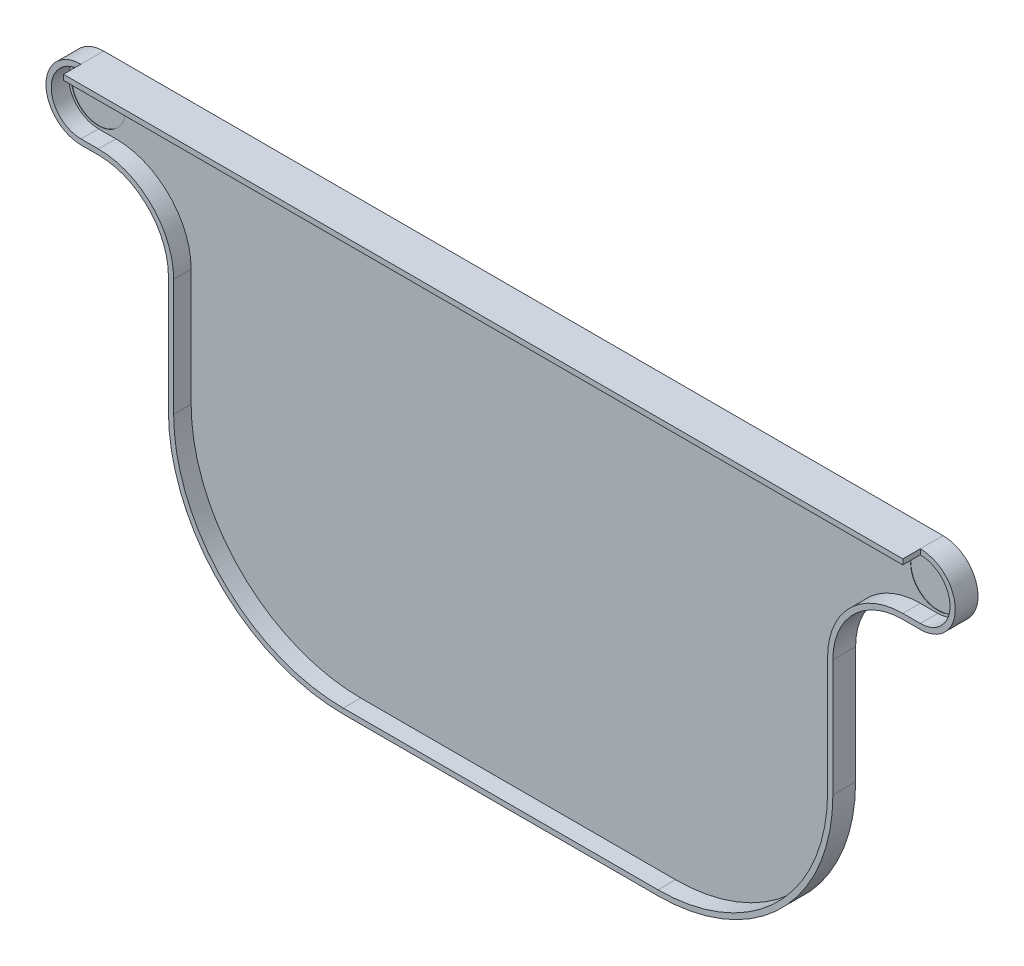
ISO-10303-21;
HEADER;
FILE_DESCRIPTION(('STEP AP214'),'2;1');
FILE_NAME('part.step','',(''),(''),'','','');
FILE_SCHEMA(('AUTOMOTIVE_DESIGN { 1 0 10303 214 1 1 1 1 }'));
ENDSEC;
DATA;
#1=APPLICATION_CONTEXT('core data for automotive mechanical design processes');
#2=APPLICATION_PROTOCOL_DEFINITION('international standard','automotive_design',2000,#1);
#3=PRODUCT_CONTEXT('',#1,'mechanical');
#4=PRODUCT('Part','Part','',(#3));
#5=PRODUCT_RELATED_PRODUCT_CATEGORY('part','',(#4));
#6=PRODUCT_DEFINITION_FORMATION('','',#4);
#7=PRODUCT_DEFINITION_CONTEXT('part definition',#1,'design');
#8=PRODUCT_DEFINITION('design','',#6,#7);
#9=PRODUCT_DEFINITION_SHAPE('','',#8);
#10=(LENGTH_UNIT() NAMED_UNIT(*) SI_UNIT(.MILLI.,.METRE.));
#11=(NAMED_UNIT(*) PLANE_ANGLE_UNIT() SI_UNIT($,.RADIAN.));
#12=(NAMED_UNIT(*) SI_UNIT($,.STERADIAN.) SOLID_ANGLE_UNIT());
#13=UNCERTAINTY_MEASURE_WITH_UNIT(LENGTH_MEASURE(1.E-05),#10,'distance_accuracy_value','');
#14=(GEOMETRIC_REPRESENTATION_CONTEXT(3) GLOBAL_UNCERTAINTY_ASSIGNED_CONTEXT((#13)) GLOBAL_UNIT_ASSIGNED_CONTEXT((#10,
#11,#12)) REPRESENTATION_CONTEXT('',''));
#15=CARTESIAN_POINT('',(0.,0.,0.));
#16=DIRECTION('',(0.,0.,1.));
#17=DIRECTION('',(1.,0.,0.));
#18=AXIS2_PLACEMENT_3D('',#15,#16,#17);
#19=CARTESIAN_POINT('',(-240.,8.91437977270883,23.));
#20=DIRECTION('',(1.,0.,0.));
#21=DIRECTION('',(0.,0.,-1.));
#22=AXIS2_PLACEMENT_3D('',#19,#20,#21);
#23=PLANE('',#22);
#24=DIRECTION('',(0.,1.,0.));
#25=VECTOR('',#24,1.);
#26=CARTESIAN_POINT('',(-240.,8.91437977270883,13.));
#27=LINE('',#26,#25);
#28=CARTESIAN_POINT('',(-240.,8.91437977270883,13.));
#29=VERTEX_POINT('',#28);
#30=CARTESIAN_POINT('',(-240.,11.9143797727088,13.));
#31=VERTEX_POINT('',#30);
#32=EDGE_CURVE('E238',#29,#31,#27,.T.);
#33=ORIENTED_EDGE('',*,*,#32,.F.);
#34=DIRECTION('',(0.,0.,-1.));
#35=VECTOR('',#34,1.);
#36=CARTESIAN_POINT('',(-240.,8.91437977270883,23.));
#37=LINE('',#36,#35);
#38=CARTESIAN_POINT('',(-240.,8.91437977270883,23.));
#39=VERTEX_POINT('',#38);
#40=EDGE_CURVE('E309',#39,#29,#37,.T.);
#41=ORIENTED_EDGE('',*,*,#40,.F.);
#42=DIRECTION('',(0.,-1.,0.));
#43=VECTOR('',#42,1.);
#44=CARTESIAN_POINT('',(-240.,8.91437977270883,23.));
#45=LINE('',#44,#43);
#46=CARTESIAN_POINT('',(-240.,11.9143797727088,23.));
#47=VERTEX_POINT('',#46);
#48=EDGE_CURVE('E287',#47,#39,#45,.T.);
#49=ORIENTED_EDGE('',*,*,#48,.F.);
#50=DIRECTION('',(0.,0.,-1.));
#51=VECTOR('',#50,1.);
#52=CARTESIAN_POINT('',(-240.,11.9143797727088,23.));
#53=LINE('',#52,#51);
#54=EDGE_CURVE('E298',#47,#31,#53,.T.);
#55=ORIENTED_EDGE('',*,*,#54,.T.);
#56=EDGE_LOOP('',(#33,#41,#49,#55));
#57=FACE_BOUND('',#56,.T.);
#58=ADVANCED_FACE('F38',(#57),#23,.F.);
#59=CARTESIAN_POINT('',(-240.,-8.08562022729117,3.));
#60=DIRECTION('',(0.,0.,-1.));
#61=DIRECTION('',(-1.,0.,0.));
#62=AXIS2_PLACEMENT_3D('',#59,#60,#61);
#63=CYLINDRICAL_SURFACE('',#62,20.);
#64=CARTESIAN_POINT('',(-240.,-8.08562022729117,0.));
#65=DIRECTION('',(0.,0.,1.));
#66=DIRECTION('',(1.,0.,0.));
#67=AXIS2_PLACEMENT_3D('',#64,#65,#66);
#68=CIRCLE('',#67,20.);
#69=CARTESIAN_POINT('',(-240.,11.9143797727087,0.));
#70=VERTEX_POINT('',#69);
#71=CARTESIAN_POINT('',(-240.,-28.0856202272913,0.));
#72=VERTEX_POINT('',#71);
#73=EDGE_CURVE('E324',#70,#72,#68,.T.);
#74=ORIENTED_EDGE('',*,*,#73,.T.);
#75=DIRECTION('',(0.,0.,-1.));
#76=VECTOR('',#75,1.);
#77=CARTESIAN_POINT('',(-240.,-28.0856202272913,3.));
#78=LINE('',#77,#76);
#79=CARTESIAN_POINT('',(-240.,-28.0856202272911,13.));
#80=VERTEX_POINT('',#79);
#81=EDGE_CURVE('E11',#80,#72,#78,.T.);
#82=ORIENTED_EDGE('',*,*,#81,.F.);
#83=CARTESIAN_POINT('',(-240.,-8.08562022729117,13.));
#84=DIRECTION('',(0.,0.,-1.));
#85=DIRECTION('',(-1.,0.,0.));
#86=AXIS2_PLACEMENT_3D('',#83,#84,#85);
#87=CIRCLE('',#86,19.9999999999999);
#88=EDGE_CURVE('E237',#80,#31,#87,.T.);
#89=ORIENTED_EDGE('',*,*,#88,.T.);
#90=DIRECTION('',(0.,0.,-1.));
#91=VECTOR('',#90,1.);
#92=CARTESIAN_POINT('',(-240.,11.9143797727087,3.));
#93=LINE('',#92,#91);
#94=EDGE_CURVE('E63',#31,#70,#93,.T.);
#95=ORIENTED_EDGE('',*,*,#94,.T.);
#96=EDGE_LOOP('',(#74,#82,#89,#95));
#97=FACE_BOUND('',#96,.T.);
#98=ADVANCED_FACE('F40',(#97),#63,.T.);
#99=CARTESIAN_POINT('',(-240.,-28.0856202272913,3.));
#100=DIRECTION('',(0.,1.,0.));
#101=DIRECTION('',(0.,0.,1.));
#102=AXIS2_PLACEMENT_3D('',#99,#100,#101);
#103=PLANE('',#102);
#104=DIRECTION('',(1.,0.,0.));
#105=VECTOR('',#104,1.);
#106=CARTESIAN_POINT('',(-240.,-28.0856202272913,0.));
#107=LINE('',#106,#105);
#108=CARTESIAN_POINT('',(-230.,-28.0856202272913,0.));
#109=VERTEX_POINT('',#108);
#110=EDGE_CURVE('E331',#72,#109,#107,.T.);
#111=ORIENTED_EDGE('',*,*,#110,.T.);
#112=DIRECTION('',(0.,0.,-1.));
#113=VECTOR('',#112,1.);
#114=CARTESIAN_POINT('',(-230.,-28.0856202272913,3.));
#115=LINE('',#114,#113);
#116=CARTESIAN_POINT('',(-230.,-28.0856202272912,13.));
#117=VERTEX_POINT('',#116);
#118=EDGE_CURVE('E47',#117,#109,#115,.T.);
#119=ORIENTED_EDGE('',*,*,#118,.F.);
#120=DIRECTION('',(1.,0.,0.));
#121=VECTOR('',#120,1.);
#122=CARTESIAN_POINT('',(-240.,-28.0856202272911,13.));
#123=LINE('',#122,#121);
#124=EDGE_CURVE('E229',#80,#117,#123,.T.);
#125=ORIENTED_EDGE('',*,*,#124,.F.);
#126=ORIENTED_EDGE('',*,*,#81,.T.);
#127=EDGE_LOOP('',(#111,#119,#125,#126));
#128=FACE_BOUND('',#127,.T.);
#129=ADVANCED_FACE('F511',(#128),#103,.F.);
#130=CARTESIAN_POINT('',(-230.,-68.0856202272913,3.));
#131=DIRECTION('',(0.,0.,-1.));
#132=DIRECTION('',(-1.,0.,0.));
#133=AXIS2_PLACEMENT_3D('',#130,#131,#132);
#134=CYLINDRICAL_SURFACE('',#133,40.);
#135=CARTESIAN_POINT('',(-230.,-68.0856202272913,0.));
#136=DIRECTION('',(0.,0.,-1.));
#137=DIRECTION('',(-1.,0.,0.));
#138=AXIS2_PLACEMENT_3D('',#135,#136,#137);
#139=CIRCLE('',#138,40.);
#140=CARTESIAN_POINT('',(-190.,-68.0856202272915,0.));
#141=VERTEX_POINT('',#140);
#142=EDGE_CURVE('E333',#109,#141,#139,.T.);
#143=ORIENTED_EDGE('',*,*,#142,.T.);
#144=DIRECTION('',(0.,0.,-1.));
#145=VECTOR('',#144,1.);
#146=CARTESIAN_POINT('',(-190.,-68.0856202272915,3.));
#147=LINE('',#146,#145);
#148=CARTESIAN_POINT('',(-190.,-68.0856202272915,13.));
#149=VERTEX_POINT('',#148);
#150=EDGE_CURVE('E375',#149,#141,#147,.T.);
#151=ORIENTED_EDGE('',*,*,#150,.F.);
#152=CARTESIAN_POINT('',(-230.,-68.0856202272913,13.));
#153=DIRECTION('',(0.,0.,-1.));
#154=DIRECTION('',(-1.,0.,0.));
#155=AXIS2_PLACEMENT_3D('',#152,#153,#154);
#156=CIRCLE('',#155,40.0000000000001);
#157=EDGE_CURVE('E383',#117,#149,#156,.T.);
#158=ORIENTED_EDGE('',*,*,#157,.F.);
#159=ORIENTED_EDGE('',*,*,#118,.T.);
#160=EDGE_LOOP('',(#143,#151,#158,#159));
#161=FACE_BOUND('',#160,.T.);
#162=ADVANCED_FACE('F381',(#161),#134,.F.);
#163=CARTESIAN_POINT('',(-190.,-68.0856202272915,3.));
#164=DIRECTION('',(1.,0.,0.));
#165=DIRECTION('',(0.,0.,-1.));
#166=AXIS2_PLACEMENT_3D('',#163,#164,#165);
#167=PLANE('',#166);
#168=DIRECTION('',(0.,-1.,0.));
#169=VECTOR('',#168,1.);
#170=CARTESIAN_POINT('',(-190.,-68.0856202272915,0.));
#171=LINE('',#170,#169);
#172=CARTESIAN_POINT('',(-190.,-135.,0.));
#173=VERTEX_POINT('',#172);
#174=EDGE_CURVE('E335',#141,#173,#171,.T.);
#175=ORIENTED_EDGE('',*,*,#174,.T.);
#176=DIRECTION('',(0.,0.,-1.));
#177=VECTOR('',#176,1.);
#178=CARTESIAN_POINT('',(-190.,-135.,3.));
#179=LINE('',#178,#177);
#180=CARTESIAN_POINT('',(-190.,-135.,13.));
#181=VERTEX_POINT('',#180);
#182=EDGE_CURVE('E372',#181,#173,#179,.T.);
#183=ORIENTED_EDGE('',*,*,#182,.F.);
#184=DIRECTION('',(0.,-1.,0.));
#185=VECTOR('',#184,1.);
#186=CARTESIAN_POINT('',(-190.,-68.0856202272915,13.));
#187=LINE('',#186,#185);
#188=EDGE_CURVE('E407',#149,#181,#187,.T.);
#189=ORIENTED_EDGE('',*,*,#188,.F.);
#190=ORIENTED_EDGE('',*,*,#150,.T.);
#191=EDGE_LOOP('',(#175,#183,#189,#190));
#192=FACE_BOUND('',#191,.T.);
#193=ADVANCED_FACE('F394',(#192),#167,.F.);
#194=CARTESIAN_POINT('',(-90.,-135.,3.));
#195=DIRECTION('',(0.,0.,-1.));
#196=DIRECTION('',(-1.,0.,0.));
#197=AXIS2_PLACEMENT_3D('',#194,#195,#196);
#198=CYLINDRICAL_SURFACE('',#197,100.);
#199=CARTESIAN_POINT('',(-90.,-135.,0.));
#200=DIRECTION('',(0.,0.,1.));
#201=DIRECTION('',(1.,0.,0.));
#202=AXIS2_PLACEMENT_3D('',#199,#200,#201);
#203=CIRCLE('',#202,100.);
#204=CARTESIAN_POINT('',(-90.,-235.,0.));
#205=VERTEX_POINT('',#204);
#206=EDGE_CURVE('E337',#173,#205,#203,.T.);
#207=ORIENTED_EDGE('',*,*,#206,.T.);
#208=DIRECTION('',(0.,0.,-1.));
#209=VECTOR('',#208,1.);
#210=CARTESIAN_POINT('',(-90.,-235.,3.));
#211=LINE('',#210,#209);
#212=CARTESIAN_POINT('',(-90.,-235.,13.));
#213=VERTEX_POINT('',#212);
#214=EDGE_CURVE('E369',#213,#205,#211,.T.);
#215=ORIENTED_EDGE('',*,*,#214,.F.);
#216=CARTESIAN_POINT('',(-90.,-135.,13.));
#217=DIRECTION('',(0.,0.,1.));
#218=DIRECTION('',(1.,0.,0.));
#219=AXIS2_PLACEMENT_3D('',#216,#217,#218);
#220=CIRCLE('',#219,100.);
#221=EDGE_CURVE('E400',#181,#213,#220,.T.);
#222=ORIENTED_EDGE('',*,*,#221,.F.);
#223=ORIENTED_EDGE('',*,*,#182,.T.);
#224=EDGE_LOOP('',(#207,#215,#222,#223));
#225=FACE_BOUND('',#224,.T.);
#226=ADVANCED_FACE('F398',(#225),#198,.T.);
#227=CARTESIAN_POINT('',(-90.,-235.,3.));
#228=DIRECTION('',(0.,1.,0.));
#229=DIRECTION('',(0.,0.,1.));
#230=AXIS2_PLACEMENT_3D('',#227,#228,#229);
#231=PLANE('',#230);
#232=DIRECTION('',(1.,0.,0.));
#233=VECTOR('',#232,1.);
#234=CARTESIAN_POINT('',(-90.,-235.,0.));
#235=LINE('',#234,#233);
#236=CARTESIAN_POINT('',(90.,-235.,0.));
#237=VERTEX_POINT('',#236);
#238=EDGE_CURVE('E339',#205,#237,#235,.T.);
#239=ORIENTED_EDGE('',*,*,#238,.T.);
#240=DIRECTION('',(0.,0.,-1.));
#241=VECTOR('',#240,1.);
#242=CARTESIAN_POINT('',(90.,-235.,3.));
#243=LINE('',#242,#241);
#244=CARTESIAN_POINT('',(90.,-235.,13.));
#245=VERTEX_POINT('',#244);
#246=EDGE_CURVE('E366',#245,#237,#243,.T.);
#247=ORIENTED_EDGE('',*,*,#246,.F.);
#248=DIRECTION('',(1.,0.,0.));
#249=VECTOR('',#248,1.);
#250=CARTESIAN_POINT('',(-90.,-235.,13.));
#251=LINE('',#250,#249);
#252=EDGE_CURVE('E429',#213,#245,#251,.T.);
#253=ORIENTED_EDGE('',*,*,#252,.F.);
#254=ORIENTED_EDGE('',*,*,#214,.T.);
#255=EDGE_LOOP('',(#239,#247,#253,#254));
#256=FACE_BOUND('',#255,.T.);
#257=ADVANCED_FACE('F542',(#256),#231,.F.);
#258=CARTESIAN_POINT('',(90.,-135.,3.));
#259=DIRECTION('',(0.,0.,-1.));
#260=DIRECTION('',(-1.,0.,0.));
#261=AXIS2_PLACEMENT_3D('',#258,#259,#260);
#262=CYLINDRICAL_SURFACE('',#261,100.);
#263=CARTESIAN_POINT('',(90.,-135.,0.));
#264=DIRECTION('',(0.,0.,1.));
#265=DIRECTION('',(-1.,0.,0.));
#266=AXIS2_PLACEMENT_3D('',#263,#264,#265);
#267=CIRCLE('',#266,100.);
#268=CARTESIAN_POINT('',(190.,-135.,0.));
#269=VERTEX_POINT('',#268);
#270=EDGE_CURVE('E341',#237,#269,#267,.T.);
#271=ORIENTED_EDGE('',*,*,#270,.T.);
#272=DIRECTION('',(0.,0.,-1.));
#273=VECTOR('',#272,1.);
#274=CARTESIAN_POINT('',(190.,-135.,3.));
#275=LINE('',#274,#273);
#276=CARTESIAN_POINT('',(190.,-135.,13.));
#277=VERTEX_POINT('',#276);
#278=EDGE_CURVE('E363',#277,#269,#275,.T.);
#279=ORIENTED_EDGE('',*,*,#278,.F.);
#280=CARTESIAN_POINT('',(90.,-135.,13.));
#281=DIRECTION('',(0.,0.,1.));
#282=DIRECTION('',(1.,0.,0.));
#283=AXIS2_PLACEMENT_3D('',#280,#281,#282);
#284=CIRCLE('',#283,99.9999999999999);
#285=EDGE_CURVE('E441',#245,#277,#284,.T.);
#286=ORIENTED_EDGE('',*,*,#285,.F.);
#287=ORIENTED_EDGE('',*,*,#246,.T.);
#288=EDGE_LOOP('',(#271,#279,#286,#287));
#289=FACE_BOUND('',#288,.T.);
#290=ADVANCED_FACE('F538',(#289),#262,.T.);
#291=CARTESIAN_POINT('',(190.,-68.0856202272915,3.));
#292=DIRECTION('',(-1.,0.,0.));
#293=DIRECTION('',(0.,0.,1.));
#294=AXIS2_PLACEMENT_3D('',#291,#292,#293);
#295=PLANE('',#294);
#296=DIRECTION('',(0.,1.,0.));
#297=VECTOR('',#296,1.);
#298=CARTESIAN_POINT('',(190.,-68.0856202272915,0.));
#299=LINE('',#298,#297);
#300=CARTESIAN_POINT('',(190.,-68.0856202272915,0.));
#301=VERTEX_POINT('',#300);
#302=EDGE_CURVE('E343',#269,#301,#299,.T.);
#303=ORIENTED_EDGE('',*,*,#302,.T.);
#304=DIRECTION('',(0.,0.,-1.));
#305=VECTOR('',#304,1.);
#306=CARTESIAN_POINT('',(190.,-68.0856202272915,3.));
#307=LINE('',#306,#305);
#308=CARTESIAN_POINT('',(190.,-68.0856202272915,13.));
#309=VERTEX_POINT('',#308);
#310=EDGE_CURVE('E360',#309,#301,#307,.T.);
#311=ORIENTED_EDGE('',*,*,#310,.F.);
#312=DIRECTION('',(0.,1.,0.));
#313=VECTOR('',#312,1.);
#314=CARTESIAN_POINT('',(190.,-135.,13.));
#315=LINE('',#314,#313);
#316=EDGE_CURVE('E452',#277,#309,#315,.T.);
#317=ORIENTED_EDGE('',*,*,#316,.F.);
#318=ORIENTED_EDGE('',*,*,#278,.T.);
#319=EDGE_LOOP('',(#303,#311,#317,#318));
#320=FACE_BOUND('',#319,.T.);
#321=ADVANCED_FACE('F534',(#320),#295,.F.);
#322=CARTESIAN_POINT('',(230.,-68.0856202272913,3.));
#323=DIRECTION('',(0.,0.,-1.));
#324=DIRECTION('',(-1.,0.,0.));
#325=AXIS2_PLACEMENT_3D('',#322,#323,#324);
#326=CYLINDRICAL_SURFACE('',#325,40.);
#327=CARTESIAN_POINT('',(230.,-68.0856202272913,0.));
#328=DIRECTION('',(0.,0.,-1.));
#329=DIRECTION('',(1.,0.,0.));
#330=AXIS2_PLACEMENT_3D('',#327,#328,#329);
#331=CIRCLE('',#330,40.);
#332=CARTESIAN_POINT('',(230.,-28.0856202272913,0.));
#333=VERTEX_POINT('',#332);
#334=EDGE_CURVE('E345',#301,#333,#331,.T.);
#335=ORIENTED_EDGE('',*,*,#334,.T.);
#336=DIRECTION('',(0.,0.,-1.));
#337=VECTOR('',#336,1.);
#338=CARTESIAN_POINT('',(230.,-28.0856202272913,3.));
#339=LINE('',#338,#337);
#340=CARTESIAN_POINT('',(230.,-28.0856202272912,13.));
#341=VERTEX_POINT('',#340);
#342=EDGE_CURVE('E357',#341,#333,#339,.T.);
#343=ORIENTED_EDGE('',*,*,#342,.F.);
#344=CARTESIAN_POINT('',(230.,-68.0856202272913,13.));
#345=DIRECTION('',(0.,0.,-1.));
#346=DIRECTION('',(-1.,0.,0.));
#347=AXIS2_PLACEMENT_3D('',#344,#345,#346);
#348=CIRCLE('',#347,40.0000000000001);
#349=EDGE_CURVE('E463',#309,#341,#348,.T.);
#350=ORIENTED_EDGE('',*,*,#349,.F.);
#351=ORIENTED_EDGE('',*,*,#310,.T.);
#352=EDGE_LOOP('',(#335,#343,#350,#351));
#353=FACE_BOUND('',#352,.T.);
#354=ADVANCED_FACE('F530',(#353),#326,.F.);
#355=CARTESIAN_POINT('',(240.,-28.0856202272913,3.));
#356=DIRECTION('',(0.,1.,0.));
#357=DIRECTION('',(0.,0.,1.));
#358=AXIS2_PLACEMENT_3D('',#355,#356,#357);
#359=PLANE('',#358);
#360=DIRECTION('',(1.,0.,0.));
#361=VECTOR('',#360,1.);
#362=CARTESIAN_POINT('',(240.,-28.0856202272913,0.));
#363=LINE('',#362,#361);
#364=CARTESIAN_POINT('',(240.,-28.0856202272913,0.));
#365=VERTEX_POINT('',#364);
#366=EDGE_CURVE('E347',#333,#365,#363,.T.);
#367=ORIENTED_EDGE('',*,*,#366,.T.);
#368=DIRECTION('',(0.,0.,-1.));
#369=VECTOR('',#368,1.);
#370=CARTESIAN_POINT('',(240.,-28.0856202272913,3.));
#371=LINE('',#370,#369);
#372=CARTESIAN_POINT('',(240.,-28.0856202272912,13.));
#373=VERTEX_POINT('',#372);
#374=EDGE_CURVE('E354',#373,#365,#371,.T.);
#375=ORIENTED_EDGE('',*,*,#374,.F.);
#376=DIRECTION('',(1.,0.,0.));
#377=VECTOR('',#376,1.);
#378=CARTESIAN_POINT('',(230.,-28.0856202272912,13.));
#379=LINE('',#378,#377);
#380=EDGE_CURVE('E474',#341,#373,#379,.T.);
#381=ORIENTED_EDGE('',*,*,#380,.F.);
#382=ORIENTED_EDGE('',*,*,#342,.T.);
#383=EDGE_LOOP('',(#367,#375,#381,#382));
#384=FACE_BOUND('',#383,.T.);
#385=ADVANCED_FACE('F527',(#384),#359,.F.);
#386=CARTESIAN_POINT('',(240.,-8.08562022729117,3.));
#387=DIRECTION('',(0.,0.,-1.));
#388=DIRECTION('',(-1.,0.,0.));
#389=AXIS2_PLACEMENT_3D('',#386,#387,#388);
#390=CYLINDRICAL_SURFACE('',#389,20.);
#391=CARTESIAN_POINT('',(240.,-8.08562022729117,0.));
#392=DIRECTION('',(0.,0.,1.));
#393=DIRECTION('',(-1.,0.,0.));
#394=AXIS2_PLACEMENT_3D('',#391,#392,#393);
#395=CIRCLE('',#394,20.);
#396=CARTESIAN_POINT('',(240.,11.9143797727088,0.));
#397=VERTEX_POINT('',#396);
#398=EDGE_CURVE('E349',#365,#397,#395,.T.);
#399=ORIENTED_EDGE('',*,*,#398,.T.);
#400=DIRECTION('',(0.,0.,-1.));
#401=VECTOR('',#400,1.);
#402=CARTESIAN_POINT('',(240.,11.9143797727088,3.));
#403=LINE('',#402,#401);
#404=CARTESIAN_POINT('',(240.,11.9143797727088,13.));
#405=VERTEX_POINT('',#404);
#406=EDGE_CURVE('E55',#405,#397,#403,.T.);
#407=ORIENTED_EDGE('',*,*,#406,.F.);
#408=CARTESIAN_POINT('',(240.,-8.08562022729117,13.));
#409=DIRECTION('',(0.,0.,1.));
#410=DIRECTION('',(1.,0.,0.));
#411=AXIS2_PLACEMENT_3D('',#408,#409,#410);
#412=CIRCLE('',#411,20.);
#413=EDGE_CURVE('E259',#373,#405,#412,.T.);
#414=ORIENTED_EDGE('',*,*,#413,.F.);
#415=ORIENTED_EDGE('',*,*,#374,.T.);
#416=EDGE_LOOP('',(#399,#407,#414,#415));
#417=FACE_BOUND('',#416,.T.);
#418=ADVANCED_FACE('F524',(#417),#390,.T.);
#419=CARTESIAN_POINT('',(-240.,11.9143797727087,3.));
#420=DIRECTION('',(0.,-1.,0.));
#421=DIRECTION('',(0.,0.,-1.));
#422=AXIS2_PLACEMENT_3D('',#419,#420,#421);
#423=PLANE('',#422);
#424=DIRECTION('',(-1.,0.,0.));
#425=VECTOR('',#424,1.);
#426=CARTESIAN_POINT('',(-240.,11.9143797727087,0.));
#427=LINE('',#426,#425);
#428=EDGE_CURVE('E351',#397,#70,#427,.T.);
#429=ORIENTED_EDGE('',*,*,#428,.T.);
#430=ORIENTED_EDGE('',*,*,#94,.F.);
#431=ORIENTED_EDGE('',*,*,#54,.F.);
#432=DIRECTION('',(-1.,0.,0.));
#433=VECTOR('',#432,1.);
#434=CARTESIAN_POINT('',(-240.,11.9143797727088,23.));
#435=LINE('',#434,#433);
#436=CARTESIAN_POINT('',(240.,11.9143797727088,23.));
#437=VERTEX_POINT('',#436);
#438=EDGE_CURVE('E295',#437,#47,#435,.T.);
#439=ORIENTED_EDGE('',*,*,#438,.F.);
#440=DIRECTION('',(0.,0.,-1.));
#441=VECTOR('',#440,1.);
#442=CARTESIAN_POINT('',(240.,11.9143797727088,23.));
#443=LINE('',#442,#441);
#444=EDGE_CURVE('E308',#437,#405,#443,.T.);
#445=ORIENTED_EDGE('',*,*,#444,.T.);
#446=ORIENTED_EDGE('',*,*,#406,.T.);
#447=EDGE_LOOP('',(#429,#430,#431,#439,#445,#446));
#448=FACE_BOUND('',#447,.T.);
#449=ADVANCED_FACE('F519',(#448),#423,.F.);
#450=CARTESIAN_POINT('',(-240.,-8.08562022729117,3.));
#451=DIRECTION('',(0.,0.,1.));
#452=DIRECTION('',(1.,0.,0.));
#453=AXIS2_PLACEMENT_3D('',#450,#451,#452);
#454=PLANE('',#453);
#455=CARTESIAN_POINT('',(-240.,-8.08562022729117,3.));
#456=DIRECTION('',(0.,0.,-1.));
#457=DIRECTION('',(-1.,0.,0.));
#458=AXIS2_PLACEMENT_3D('',#455,#456,#457);
#459=CIRCLE('',#458,17.);
#460=CARTESIAN_POINT('',(-240.,-25.0856202272912,3.));
#461=VERTEX_POINT('',#460);
#462=CARTESIAN_POINT('',(-240.,8.91437977270883,3.));
#463=VERTEX_POINT('',#462);
#464=EDGE_CURVE('E242',#461,#463,#459,.T.);
#465=ORIENTED_EDGE('',*,*,#464,.F.);
#466=DIRECTION('',(1.,0.,0.));
#467=VECTOR('',#466,1.);
#468=CARTESIAN_POINT('',(-240.,-25.0856202272912,3.));
#469=LINE('',#468,#467);
#470=CARTESIAN_POINT('',(-230.,-25.0856202272913,3.));
#471=VERTEX_POINT('',#470);
#472=EDGE_CURVE('E228',#461,#471,#469,.T.);
#473=ORIENTED_EDGE('',*,*,#472,.T.);
#474=CARTESIAN_POINT('',(-230.,-68.0856202272913,3.));
#475=DIRECTION('',(0.,0.,-1.));
#476=DIRECTION('',(-1.,0.,0.));
#477=AXIS2_PLACEMENT_3D('',#474,#475,#476);
#478=CIRCLE('',#477,43.);
#479=CARTESIAN_POINT('',(-187.,-68.0856202272913,3.));
#480=VERTEX_POINT('',#479);
#481=EDGE_CURVE('E415',#471,#480,#478,.T.);
#482=ORIENTED_EDGE('',*,*,#481,.T.);
#483=DIRECTION('',(0.,-1.,0.));
#484=VECTOR('',#483,1.);
#485=CARTESIAN_POINT('',(-187.,-68.0856202272915,3.));
#486=LINE('',#485,#484);
#487=CARTESIAN_POINT('',(-187.,-135.,3.));
#488=VERTEX_POINT('',#487);
#489=EDGE_CURVE('E412',#480,#488,#486,.T.);
#490=ORIENTED_EDGE('',*,*,#489,.T.);
#491=CARTESIAN_POINT('',(-90.,-135.,3.));
#492=DIRECTION('',(0.,0.,1.));
#493=DIRECTION('',(1.,0.,0.));
#494=AXIS2_PLACEMENT_3D('',#491,#492,#493);
#495=CIRCLE('',#494,97.);
#496=CARTESIAN_POINT('',(-90.,-232.,3.));
#497=VERTEX_POINT('',#496);
#498=EDGE_CURVE('E424',#488,#497,#495,.T.);
#499=ORIENTED_EDGE('',*,*,#498,.T.);
#500=DIRECTION('',(1.,0.,0.));
#501=VECTOR('',#500,1.);
#502=CARTESIAN_POINT('',(-90.,-232.,3.));
#503=LINE('',#502,#501);
#504=CARTESIAN_POINT('',(90.,-232.,3.));
#505=VERTEX_POINT('',#504);
#506=EDGE_CURVE('E436',#497,#505,#503,.T.);
#507=ORIENTED_EDGE('',*,*,#506,.T.);
#508=CARTESIAN_POINT('',(90.,-135.,3.));
#509=DIRECTION('',(0.,0.,1.));
#510=DIRECTION('',(1.,0.,0.));
#511=AXIS2_PLACEMENT_3D('',#508,#509,#510);
#512=CIRCLE('',#511,97.);
#513=CARTESIAN_POINT('',(187.,-135.,3.));
#514=VERTEX_POINT('',#513);
#515=EDGE_CURVE('E447',#505,#514,#512,.T.);
#516=ORIENTED_EDGE('',*,*,#515,.T.);
#517=DIRECTION('',(0.,1.,0.));
#518=VECTOR('',#517,1.);
#519=CARTESIAN_POINT('',(187.,-135.,3.));
#520=LINE('',#519,#518);
#521=CARTESIAN_POINT('',(187.,-68.0856202272914,3.));
#522=VERTEX_POINT('',#521);
#523=EDGE_CURVE('E458',#514,#522,#520,.T.);
#524=ORIENTED_EDGE('',*,*,#523,.T.);
#525=CARTESIAN_POINT('',(230.,-68.0856202272913,3.));
#526=DIRECTION('',(0.,0.,-1.));
#527=DIRECTION('',(-1.,0.,0.));
#528=AXIS2_PLACEMENT_3D('',#525,#526,#527);
#529=CIRCLE('',#528,43.0000000000001);
#530=CARTESIAN_POINT('',(230.,-25.0856202272912,3.));
#531=VERTEX_POINT('',#530);
#532=EDGE_CURVE('E469',#522,#531,#529,.T.);
#533=ORIENTED_EDGE('',*,*,#532,.T.);
#534=DIRECTION('',(1.,0.,0.));
#535=VECTOR('',#534,1.);
#536=CARTESIAN_POINT('',(230.,-25.0856202272912,3.));
#537=LINE('',#536,#535);
#538=CARTESIAN_POINT('',(240.,-25.0856202272912,3.));
#539=VERTEX_POINT('',#538);
#540=EDGE_CURVE('E265',#531,#539,#537,.T.);
#541=ORIENTED_EDGE('',*,*,#540,.T.);
#542=CARTESIAN_POINT('',(240.,-8.08562022729117,3.));
#543=DIRECTION('',(0.,0.,1.));
#544=DIRECTION('',(1.,0.,0.));
#545=AXIS2_PLACEMENT_3D('',#542,#543,#544);
#546=CIRCLE('',#545,17.0000000000001);
#547=CARTESIAN_POINT('',(240.,8.91437977270883,3.));
#548=VERTEX_POINT('',#547);
#549=EDGE_CURVE('E272',#539,#548,#546,.T.);
#550=ORIENTED_EDGE('',*,*,#549,.T.);
#551=DIRECTION('',(1.,0.,0.));
#552=VECTOR('',#551,1.);
#553=CARTESIAN_POINT('',(-240.,8.91437977270883,3.));
#554=LINE('',#553,#552);
#555=EDGE_CURVE('E284',#463,#548,#554,.T.);
#556=ORIENTED_EDGE('',*,*,#555,.F.);
#557=EDGE_LOOP('',(#465,#473,#482,#490,#499,#507,#516,#524,#533,#541,#550,#556));
#558=FACE_BOUND('',#557,.T.);
#559=CARTESIAN_POINT('',(240.,-8.08562022729114,3.));
#560=DIRECTION('',(0.,0.,1.));
#561=DIRECTION('',(-1.,0.,0.));
#562=AXIS2_PLACEMENT_3D('',#559,#560,#561);
#563=CIRCLE('',#562,15.5);
#564=CARTESIAN_POINT('',(224.5,-8.08562022729114,3.));
#565=VERTEX_POINT('',#564);
#566=EDGE_CURVE('E274',#565,#565,#563,.T.);
#567=ORIENTED_EDGE('',*,*,#566,.F.);
#568=EDGE_LOOP('',(#567));
#569=FACE_BOUND('',#568,.T.);
#570=CARTESIAN_POINT('',(-240.,-8.0856202272912,3.));
#571=DIRECTION('',(0.,0.,1.));
#572=DIRECTION('',(1.,0.,0.));
#573=AXIS2_PLACEMENT_3D('',#570,#571,#572);
#574=CIRCLE('',#573,15.5);
#575=CARTESIAN_POINT('',(-224.5,-8.0856202272912,3.));
#576=VERTEX_POINT('',#575);
#577=EDGE_CURVE('E278',#576,#576,#574,.T.);
#578=ORIENTED_EDGE('',*,*,#577,.F.);
#579=EDGE_LOOP('',(#578));
#580=FACE_BOUND('',#579,.T.);
#581=ADVANCED_FACE('F483',(#558,#569,#580),#454,.T.);
#582=CARTESIAN_POINT('',(-240.,-8.08562022729117,0.));
#583=DIRECTION('',(0.,0.,1.));
#584=DIRECTION('',(1.,0.,0.));
#585=AXIS2_PLACEMENT_3D('',#582,#583,#584);
#586=PLANE('',#585);
#587=ORIENTED_EDGE('',*,*,#73,.F.);
#588=ORIENTED_EDGE('',*,*,#428,.F.);
#589=ORIENTED_EDGE('',*,*,#398,.F.);
#590=ORIENTED_EDGE('',*,*,#366,.F.);
#591=ORIENTED_EDGE('',*,*,#334,.F.);
#592=ORIENTED_EDGE('',*,*,#302,.F.);
#593=ORIENTED_EDGE('',*,*,#270,.F.);
#594=ORIENTED_EDGE('',*,*,#238,.F.);
#595=ORIENTED_EDGE('',*,*,#206,.F.);
#596=ORIENTED_EDGE('',*,*,#174,.F.);
#597=ORIENTED_EDGE('',*,*,#142,.F.);
#598=ORIENTED_EDGE('',*,*,#110,.F.);
#599=EDGE_LOOP('',(#587,#588,#589,#590,#591,#592,#593,#594,#595,#596,#597,#598));
#600=FACE_BOUND('',#599,.T.);
#601=ADVANCED_FACE('F390',(#600),#586,.F.);
#602=CARTESIAN_POINT('',(-240.,8.91437977270883,23.));
#603=DIRECTION('',(0.,1.,0.));
#604=DIRECTION('',(0.,0.,1.));
#605=AXIS2_PLACEMENT_3D('',#602,#603,#604);
#606=PLANE('',#605);
#607=ORIENTED_EDGE('',*,*,#555,.T.);
#608=DIRECTION('',(0.,0.,1.));
#609=VECTOR('',#608,1.);
#610=CARTESIAN_POINT('',(240.,8.91437977270888,3.));
#611=LINE('',#610,#609);
#612=CARTESIAN_POINT('',(240.,8.91437977270883,13.));
#613=VERTEX_POINT('',#612);
#614=EDGE_CURVE('E257',#548,#613,#611,.T.);
#615=ORIENTED_EDGE('',*,*,#614,.T.);
#616=DIRECTION('',(0.,0.,-1.));
#617=VECTOR('',#616,1.);
#618=CARTESIAN_POINT('',(240.,8.91437977270883,23.));
#619=LINE('',#618,#617);
#620=CARTESIAN_POINT('',(240.,8.91437977270883,23.));
#621=VERTEX_POINT('',#620);
#622=EDGE_CURVE('E313',#621,#613,#619,.T.);
#623=ORIENTED_EDGE('',*,*,#622,.F.);
#624=DIRECTION('',(1.,0.,0.));
#625=VECTOR('',#624,1.);
#626=CARTESIAN_POINT('',(-240.,8.91437977270883,23.));
#627=LINE('',#626,#625);
#628=EDGE_CURVE('E290',#39,#621,#627,.T.);
#629=ORIENTED_EDGE('',*,*,#628,.F.);
#630=ORIENTED_EDGE('',*,*,#40,.T.);
#631=DIRECTION('',(0.,0.,1.));
#632=VECTOR('',#631,1.);
#633=CARTESIAN_POINT('',(-240.,8.91437977270883,3.));
#634=LINE('',#633,#632);
#635=EDGE_CURVE('E241',#463,#29,#634,.T.);
#636=ORIENTED_EDGE('',*,*,#635,.F.);
#637=EDGE_LOOP('',(#607,#615,#623,#629,#630,#636));
#638=FACE_BOUND('',#637,.T.);
#639=ADVANCED_FACE('F515',(#638),#606,.F.);
#640=CARTESIAN_POINT('',(240.,8.91437977270883,23.));
#641=DIRECTION('',(-1.,0.,0.));
#642=DIRECTION('',(0.,0.,1.));
#643=AXIS2_PLACEMENT_3D('',#640,#641,#642);
#644=PLANE('',#643);
#645=ORIENTED_EDGE('',*,*,#622,.T.);
#646=DIRECTION('',(0.,1.,0.));
#647=VECTOR('',#646,1.);
#648=CARTESIAN_POINT('',(240.,8.91437977270888,13.));
#649=LINE('',#648,#647);
#650=EDGE_CURVE('E260',#613,#405,#649,.T.);
#651=ORIENTED_EDGE('',*,*,#650,.T.);
#652=ORIENTED_EDGE('',*,*,#444,.F.);
#653=DIRECTION('',(0.,1.,0.));
#654=VECTOR('',#653,1.);
#655=CARTESIAN_POINT('',(240.,8.91437977270883,23.));
#656=LINE('',#655,#654);
#657=EDGE_CURVE('E293',#621,#437,#656,.T.);
#658=ORIENTED_EDGE('',*,*,#657,.F.);
#659=EDGE_LOOP('',(#645,#651,#652,#658));
#660=FACE_BOUND('',#659,.T.);
#661=ADVANCED_FACE('F565',(#660),#644,.F.);
#662=CARTESIAN_POINT('',(0.,0.,23.));
#663=DIRECTION('',(0.,0.,-1.));
#664=DIRECTION('',(-1.,0.,0.));
#665=AXIS2_PLACEMENT_3D('',#662,#663,#664);
#666=PLANE('',#665);
#667=ORIENTED_EDGE('',*,*,#48,.T.);
#668=ORIENTED_EDGE('',*,*,#628,.T.);
#669=ORIENTED_EDGE('',*,*,#657,.T.);
#670=ORIENTED_EDGE('',*,*,#438,.T.);
#671=EDGE_LOOP('',(#667,#668,#669,#670));
#672=FACE_BOUND('',#671,.T.);
#673=ADVANCED_FACE('F568',(#672),#666,.F.);
#674=CARTESIAN_POINT('',(-240.,-8.0856202272912,2.8));
#675=DIRECTION('',(0.,0.,1.));
#676=DIRECTION('',(1.,0.,0.));
#677=AXIS2_PLACEMENT_3D('',#674,#675,#676);
#678=CYLINDRICAL_SURFACE('',#677,15.5);
#679=CARTESIAN_POINT('',(-240.,-8.0856202272912,2.8));
#680=DIRECTION('',(0.,0.,1.));
#681=DIRECTION('',(1.,0.,0.));
#682=AXIS2_PLACEMENT_3D('',#679,#680,#681);
#683=CIRCLE('',#682,15.5);
#684=CARTESIAN_POINT('',(-224.5,-8.0856202272912,2.8));
#685=VERTEX_POINT('',#684);
#686=EDGE_CURVE('E281',#685,#685,#683,.T.);
#687=ORIENTED_EDGE('',*,*,#686,.F.);
#688=EDGE_LOOP('',(#687));
#689=FACE_BOUND('',#688,.T.);
#690=ORIENTED_EDGE('',*,*,#577,.T.);
#691=EDGE_LOOP('',(#690));
#692=FACE_BOUND('',#691,.T.);
#693=ADVANCED_FACE('F810',(#689,#692),#678,.F.);
#694=CARTESIAN_POINT('',(-240.,-8.0856202272912,2.8));
#695=DIRECTION('',(0.,0.,1.));
#696=DIRECTION('',(1.,0.,0.));
#697=AXIS2_PLACEMENT_3D('',#694,#695,#696);
#698=PLANE('',#697);
#699=ORIENTED_EDGE('',*,*,#686,.T.);
#700=EDGE_LOOP('',(#699));
#701=FACE_BOUND('',#700,.T.);
#702=ADVANCED_FACE('F800',(#701),#698,.T.);
#703=CARTESIAN_POINT('',(240.,-8.08562022729114,2.8));
#704=DIRECTION('',(0.,0.,1.));
#705=DIRECTION('',(1.,0.,0.));
#706=AXIS2_PLACEMENT_3D('',#703,#704,#705);
#707=CYLINDRICAL_SURFACE('',#706,15.5);
#708=CARTESIAN_POINT('',(240.,-8.08562022729114,2.8));
#709=DIRECTION('',(0.,0.,1.));
#710=DIRECTION('',(-1.,0.,0.));
#711=AXIS2_PLACEMENT_3D('',#708,#709,#710);
#712=CIRCLE('',#711,15.5);
#713=CARTESIAN_POINT('',(224.5,-8.08562022729114,2.8));
#714=VERTEX_POINT('',#713);
#715=EDGE_CURVE('E275',#714,#714,#712,.T.);
#716=ORIENTED_EDGE('',*,*,#715,.F.);
#717=EDGE_LOOP('',(#716));
#718=FACE_BOUND('',#717,.T.);
#719=ORIENTED_EDGE('',*,*,#566,.T.);
#720=EDGE_LOOP('',(#719));
#721=FACE_BOUND('',#720,.T.);
#722=ADVANCED_FACE('F790',(#718,#721),#707,.F.);
#723=CARTESIAN_POINT('',(240.,-8.08562022729114,2.8));
#724=DIRECTION('',(0.,0.,-1.));
#725=DIRECTION('',(-1.,0.,0.));
#726=AXIS2_PLACEMENT_3D('',#723,#724,#725);
#727=PLANE('',#726);
#728=ORIENTED_EDGE('',*,*,#715,.T.);
#729=EDGE_LOOP('',(#728));
#730=FACE_BOUND('',#729,.T.);
#731=ADVANCED_FACE('F503',(#730),#727,.F.);
#732=CARTESIAN_POINT('',(240.,-8.08562022729117,3.));
#733=DIRECTION('',(0.,0.,1.));
#734=DIRECTION('',(1.,0.,0.));
#735=AXIS2_PLACEMENT_3D('',#732,#733,#734);
#736=CYLINDRICAL_SURFACE('',#735,17.0000000000001);
#737=DIRECTION('',(0.,0.,1.));
#738=VECTOR('',#737,1.);
#739=CARTESIAN_POINT('',(240.,-25.0856202272912,3.));
#740=LINE('',#739,#738);
#741=CARTESIAN_POINT('',(240.,-25.0856202272912,13.));
#742=VERTEX_POINT('',#741);
#743=EDGE_CURVE('E471',#539,#742,#740,.T.);
#744=ORIENTED_EDGE('',*,*,#743,.T.);
#745=CARTESIAN_POINT('',(240.,-8.08562022729117,13.));
#746=DIRECTION('',(0.,0.,1.));
#747=DIRECTION('',(1.,0.,0.));
#748=AXIS2_PLACEMENT_3D('',#745,#746,#747);
#749=CIRCLE('',#748,17.0000000000001);
#750=EDGE_CURVE('E266',#742,#613,#749,.T.);
#751=ORIENTED_EDGE('',*,*,#750,.T.);
#752=ORIENTED_EDGE('',*,*,#614,.F.);
#753=ORIENTED_EDGE('',*,*,#549,.F.);
#754=EDGE_LOOP('',(#744,#751,#752,#753));
#755=FACE_BOUND('',#754,.T.);
#756=ADVANCED_FACE('F490',(#755),#736,.F.);
#757=CARTESIAN_POINT('',(230.,-25.0856202272912,3.));
#758=DIRECTION('',(0.,1.,0.));
#759=DIRECTION('',(-1.,0.,0.));
#760=AXIS2_PLACEMENT_3D('',#757,#758,#759);
#761=PLANE('',#760);
#762=DIRECTION('',(0.,0.,1.));
#763=VECTOR('',#762,1.);
#764=CARTESIAN_POINT('',(230.,-25.0856202272912,3.));
#765=LINE('',#764,#763);
#766=CARTESIAN_POINT('',(230.,-25.0856202272912,13.));
#767=VERTEX_POINT('',#766);
#768=EDGE_CURVE('E460',#531,#767,#765,.T.);
#769=ORIENTED_EDGE('',*,*,#768,.T.);
#770=DIRECTION('',(1.,0.,0.));
#771=VECTOR('',#770,1.);
#772=CARTESIAN_POINT('',(230.,-25.0856202272912,13.));
#773=LINE('',#772,#771);
#774=EDGE_CURVE('E476',#767,#742,#773,.T.);
#775=ORIENTED_EDGE('',*,*,#774,.T.);
#776=ORIENTED_EDGE('',*,*,#743,.F.);
#777=ORIENTED_EDGE('',*,*,#540,.F.);
#778=EDGE_LOOP('',(#769,#775,#776,#777));
#779=FACE_BOUND('',#778,.T.);
#780=ADVANCED_FACE('F492',(#779),#761,.T.);
#781=CARTESIAN_POINT('',(230.,-68.0856202272913,3.));
#782=DIRECTION('',(0.,0.,-1.));
#783=DIRECTION('',(-1.,0.,0.));
#784=AXIS2_PLACEMENT_3D('',#781,#782,#783);
#785=CYLINDRICAL_SURFACE('',#784,43.0000000000001);
#786=DIRECTION('',(0.,0.,1.));
#787=VECTOR('',#786,1.);
#788=CARTESIAN_POINT('',(187.,-68.0856202272914,3.));
#789=LINE('',#788,#787);
#790=CARTESIAN_POINT('',(187.,-68.0856202272914,13.));
#791=VERTEX_POINT('',#790);
#792=EDGE_CURVE('E449',#522,#791,#789,.T.);
#793=ORIENTED_EDGE('',*,*,#792,.T.);
#794=CARTESIAN_POINT('',(230.,-68.0856202272913,13.));
#795=DIRECTION('',(0.,0.,-1.));
#796=DIRECTION('',(-1.,0.,0.));
#797=AXIS2_PLACEMENT_3D('',#794,#795,#796);
#798=CIRCLE('',#797,43.0000000000001);
#799=EDGE_CURVE('E466',#791,#767,#798,.T.);
#800=ORIENTED_EDGE('',*,*,#799,.T.);
#801=ORIENTED_EDGE('',*,*,#768,.F.);
#802=ORIENTED_EDGE('',*,*,#532,.F.);
#803=EDGE_LOOP('',(#793,#800,#801,#802));
#804=FACE_BOUND('',#803,.T.);
#805=ADVANCED_FACE('F494',(#804),#785,.T.);
#806=CARTESIAN_POINT('',(187.,-135.,3.));
#807=DIRECTION('',(-1.,0.,0.));
#808=DIRECTION('',(0.,0.,1.));
#809=AXIS2_PLACEMENT_3D('',#806,#807,#808);
#810=PLANE('',#809);
#811=DIRECTION('',(0.,0.,1.));
#812=VECTOR('',#811,1.);
#813=CARTESIAN_POINT('',(187.,-135.,3.));
#814=LINE('',#813,#812);
#815=CARTESIAN_POINT('',(187.,-135.,13.));
#816=VERTEX_POINT('',#815);
#817=EDGE_CURVE('E438',#514,#816,#814,.T.);
#818=ORIENTED_EDGE('',*,*,#817,.T.);
#819=DIRECTION('',(0.,1.,0.));
#820=VECTOR('',#819,1.);
#821=CARTESIAN_POINT('',(187.,-135.,13.));
#822=LINE('',#821,#820);
#823=EDGE_CURVE('E455',#816,#791,#822,.T.);
#824=ORIENTED_EDGE('',*,*,#823,.T.);
#825=ORIENTED_EDGE('',*,*,#792,.F.);
#826=ORIENTED_EDGE('',*,*,#523,.F.);
#827=EDGE_LOOP('',(#818,#824,#825,#826));
#828=FACE_BOUND('',#827,.T.);
#829=ADVANCED_FACE('F500',(#828),#810,.T.);
#830=CARTESIAN_POINT('',(90.,-135.,3.));
#831=DIRECTION('',(0.,0.,1.));
#832=DIRECTION('',(1.,0.,0.));
#833=AXIS2_PLACEMENT_3D('',#830,#831,#832);
#834=CYLINDRICAL_SURFACE('',#833,97.);
#835=DIRECTION('',(0.,0.,1.));
#836=VECTOR('',#835,1.);
#837=CARTESIAN_POINT('',(90.,-232.,3.));
#838=LINE('',#837,#836);
#839=CARTESIAN_POINT('',(90.,-232.,13.));
#840=VERTEX_POINT('',#839);
#841=EDGE_CURVE('E426',#505,#840,#838,.T.);
#842=ORIENTED_EDGE('',*,*,#841,.T.);
#843=CARTESIAN_POINT('',(90.,-135.,13.));
#844=DIRECTION('',(0.,0.,1.));
#845=DIRECTION('',(1.,0.,0.));
#846=AXIS2_PLACEMENT_3D('',#843,#844,#845);
#847=CIRCLE('',#846,97.);
#848=EDGE_CURVE('E444',#840,#816,#847,.T.);
#849=ORIENTED_EDGE('',*,*,#848,.T.);
#850=ORIENTED_EDGE('',*,*,#817,.F.);
#851=ORIENTED_EDGE('',*,*,#515,.F.);
#852=EDGE_LOOP('',(#842,#849,#850,#851));
#853=FACE_BOUND('',#852,.T.);
#854=ADVANCED_FACE('F599',(#853),#834,.F.);
#855=CARTESIAN_POINT('',(-90.,-232.,3.));
#856=DIRECTION('',(0.,1.,0.));
#857=DIRECTION('',(-1.,0.,0.));
#858=AXIS2_PLACEMENT_3D('',#855,#856,#857);
#859=PLANE('',#858);
#860=DIRECTION('',(0.,0.,1.));
#861=VECTOR('',#860,1.);
#862=CARTESIAN_POINT('',(-90.,-232.,3.));
#863=LINE('',#862,#861);
#864=CARTESIAN_POINT('',(-90.,-232.,13.));
#865=VERTEX_POINT('',#864);
#866=EDGE_CURVE('E405',#497,#865,#863,.T.);
#867=ORIENTED_EDGE('',*,*,#866,.T.);
#868=DIRECTION('',(1.,0.,0.));
#869=VECTOR('',#868,1.);
#870=CARTESIAN_POINT('',(-90.,-232.,13.));
#871=LINE('',#870,#869);
#872=EDGE_CURVE('E432',#865,#840,#871,.T.);
#873=ORIENTED_EDGE('',*,*,#872,.T.);
#874=ORIENTED_EDGE('',*,*,#841,.F.);
#875=ORIENTED_EDGE('',*,*,#506,.F.);
#876=EDGE_LOOP('',(#867,#873,#874,#875));
#877=FACE_BOUND('',#876,.T.);
#878=ADVANCED_FACE('F593',(#877),#859,.T.);
#879=CARTESIAN_POINT('',(-90.,-135.,3.));
#880=DIRECTION('',(0.,0.,1.));
#881=DIRECTION('',(1.,0.,0.));
#882=AXIS2_PLACEMENT_3D('',#879,#880,#881);
#883=CYLINDRICAL_SURFACE('',#882,97.);
#884=DIRECTION('',(0.,0.,1.));
#885=VECTOR('',#884,1.);
#886=CARTESIAN_POINT('',(-187.,-135.,3.));
#887=LINE('',#886,#885);
#888=CARTESIAN_POINT('',(-187.,-135.,13.));
#889=VERTEX_POINT('',#888);
#890=EDGE_CURVE('E409',#488,#889,#887,.T.);
#891=ORIENTED_EDGE('',*,*,#890,.T.);
#892=CARTESIAN_POINT('',(-90.,-135.,13.));
#893=DIRECTION('',(0.,0.,1.));
#894=DIRECTION('',(1.,0.,0.));
#895=AXIS2_PLACEMENT_3D('',#892,#893,#894);
#896=CIRCLE('',#895,97.);
#897=EDGE_CURVE('E404',#889,#865,#896,.T.);
#898=ORIENTED_EDGE('',*,*,#897,.T.);
#899=ORIENTED_EDGE('',*,*,#866,.F.);
#900=ORIENTED_EDGE('',*,*,#498,.F.);
#901=EDGE_LOOP('',(#891,#898,#899,#900));
#902=FACE_BOUND('',#901,.T.);
#903=ADVANCED_FACE('F591',(#902),#883,.F.);
#904=CARTESIAN_POINT('',(-187.,-68.0856202272915,3.));
#905=DIRECTION('',(1.,0.,0.));
#906=DIRECTION('',(0.,0.,-1.));
#907=AXIS2_PLACEMENT_3D('',#904,#905,#906);
#908=PLANE('',#907);
#909=DIRECTION('',(0.,0.,1.));
#910=VECTOR('',#909,1.);
#911=CARTESIAN_POINT('',(-187.,-68.0856202272915,3.));
#912=LINE('',#911,#910);
#913=CARTESIAN_POINT('',(-187.,-68.0856202272915,13.));
#914=VERTEX_POINT('',#913);
#915=EDGE_CURVE('E573',#480,#914,#912,.T.);
#916=ORIENTED_EDGE('',*,*,#915,.T.);
#917=DIRECTION('',(0.,-1.,0.));
#918=VECTOR('',#917,1.);
#919=CARTESIAN_POINT('',(-187.,-68.0856202272915,13.));
#920=LINE('',#919,#918);
#921=EDGE_CURVE('E408',#914,#889,#920,.T.);
#922=ORIENTED_EDGE('',*,*,#921,.T.);
#923=ORIENTED_EDGE('',*,*,#890,.F.);
#924=ORIENTED_EDGE('',*,*,#489,.F.);
#925=EDGE_LOOP('',(#916,#922,#923,#924));
#926=FACE_BOUND('',#925,.T.);
#927=ADVANCED_FACE('F585',(#926),#908,.T.);
#928=CARTESIAN_POINT('',(-230.,-68.0856202272913,3.));
#929=DIRECTION('',(0.,0.,-1.));
#930=DIRECTION('',(-1.,0.,0.));
#931=AXIS2_PLACEMENT_3D('',#928,#929,#930);
#932=CYLINDRICAL_SURFACE('',#931,43.);
#933=DIRECTION('',(0.,0.,1.));
#934=VECTOR('',#933,1.);
#935=CARTESIAN_POINT('',(-230.,-25.0856202272913,3.));
#936=LINE('',#935,#934);
#937=CARTESIAN_POINT('',(-230.,-25.0856202272913,13.));
#938=VERTEX_POINT('',#937);
#939=EDGE_CURVE('E244',#471,#938,#936,.T.);
#940=ORIENTED_EDGE('',*,*,#939,.T.);
#941=CARTESIAN_POINT('',(-230.,-68.0856202272913,13.));
#942=DIRECTION('',(0.,0.,-1.));
#943=DIRECTION('',(-1.,0.,0.));
#944=AXIS2_PLACEMENT_3D('',#941,#942,#943);
#945=CIRCLE('',#944,43.);
#946=EDGE_CURVE('E224',#938,#914,#945,.T.);
#947=ORIENTED_EDGE('',*,*,#946,.T.);
#948=ORIENTED_EDGE('',*,*,#915,.F.);
#949=ORIENTED_EDGE('',*,*,#481,.F.);
#950=EDGE_LOOP('',(#940,#947,#948,#949));
#951=FACE_BOUND('',#950,.T.);
#952=ADVANCED_FACE('F577',(#951),#932,.T.);
#953=CARTESIAN_POINT('',(-240.,-25.0856202272912,3.));
#954=DIRECTION('',(0.,1.,0.));
#955=DIRECTION('',(-1.,0.,0.));
#956=AXIS2_PLACEMENT_3D('',#953,#954,#955);
#957=PLANE('',#956);
#958=DIRECTION('',(0.,0.,1.));
#959=VECTOR('',#958,1.);
#960=CARTESIAN_POINT('',(-240.,-25.0856202272912,3.));
#961=LINE('',#960,#959);
#962=CARTESIAN_POINT('',(-240.,-25.0856202272912,13.));
#963=VERTEX_POINT('',#962);
#964=EDGE_CURVE('E233',#461,#963,#961,.T.);
#965=ORIENTED_EDGE('',*,*,#964,.T.);
#966=DIRECTION('',(1.,0.,0.));
#967=VECTOR('',#966,1.);
#968=CARTESIAN_POINT('',(-240.,-25.0856202272912,13.));
#969=LINE('',#968,#967);
#970=EDGE_CURVE('E215',#963,#938,#969,.T.);
#971=ORIENTED_EDGE('',*,*,#970,.T.);
#972=ORIENTED_EDGE('',*,*,#939,.F.);
#973=ORIENTED_EDGE('',*,*,#472,.F.);
#974=EDGE_LOOP('',(#965,#971,#972,#973));
#975=FACE_BOUND('',#974,.T.);
#976=ADVANCED_FACE('F234',(#975),#957,.T.);
#977=CARTESIAN_POINT('',(-240.,-8.08562022729117,3.));
#978=DIRECTION('',(0.,0.,-1.));
#979=DIRECTION('',(-1.,0.,0.));
#980=AXIS2_PLACEMENT_3D('',#977,#978,#979);
#981=CYLINDRICAL_SURFACE('',#980,17.);
#982=CARTESIAN_POINT('',(-240.,-8.08562022729117,13.));
#983=DIRECTION('',(0.,0.,-1.));
#984=DIRECTION('',(-1.,0.,0.));
#985=AXIS2_PLACEMENT_3D('',#982,#983,#984);
#986=CIRCLE('',#985,17.);
#987=EDGE_CURVE('E221',#963,#29,#986,.T.);
#988=ORIENTED_EDGE('',*,*,#987,.F.);
#989=ORIENTED_EDGE('',*,*,#964,.F.);
#990=ORIENTED_EDGE('',*,*,#464,.T.);
#991=ORIENTED_EDGE('',*,*,#635,.T.);
#992=EDGE_LOOP('',(#988,#989,#990,#991));
#993=FACE_BOUND('',#992,.T.);
#994=ADVANCED_FACE('F240',(#993),#981,.F.);
#995=CARTESIAN_POINT('',(-240.,-25.0856202272912,13.));
#996=DIRECTION('',(0.,0.,-1.));
#997=DIRECTION('',(-1.,0.,0.));
#998=AXIS2_PLACEMENT_3D('',#995,#996,#997);
#999=PLANE('',#998);
#1000=ORIENTED_EDGE('',*,*,#88,.F.);
#1001=ORIENTED_EDGE('',*,*,#124,.T.);
#1002=ORIENTED_EDGE('',*,*,#157,.T.);
#1003=ORIENTED_EDGE('',*,*,#188,.T.);
#1004=ORIENTED_EDGE('',*,*,#221,.T.);
#1005=ORIENTED_EDGE('',*,*,#252,.T.);
#1006=ORIENTED_EDGE('',*,*,#285,.T.);
#1007=ORIENTED_EDGE('',*,*,#316,.T.);
#1008=ORIENTED_EDGE('',*,*,#349,.T.);
#1009=ORIENTED_EDGE('',*,*,#380,.T.);
#1010=ORIENTED_EDGE('',*,*,#413,.T.);
#1011=ORIENTED_EDGE('',*,*,#650,.F.);
#1012=ORIENTED_EDGE('',*,*,#750,.F.);
#1013=ORIENTED_EDGE('',*,*,#774,.F.);
#1014=ORIENTED_EDGE('',*,*,#799,.F.);
#1015=ORIENTED_EDGE('',*,*,#823,.F.);
#1016=ORIENTED_EDGE('',*,*,#848,.F.);
#1017=ORIENTED_EDGE('',*,*,#872,.F.);
#1018=ORIENTED_EDGE('',*,*,#897,.F.);
#1019=ORIENTED_EDGE('',*,*,#921,.F.);
#1020=ORIENTED_EDGE('',*,*,#946,.F.);
#1021=ORIENTED_EDGE('',*,*,#970,.F.);
#1022=ORIENTED_EDGE('',*,*,#987,.T.);
#1023=ORIENTED_EDGE('',*,*,#32,.T.);
#1024=EDGE_LOOP('',(#1000,#1001,#1002,#1003,#1004,#1005,#1006,#1007,#1008,#1009,#1010,#1011,
#1012,#1013,#1014,#1015,#1016,#1017,#1018,#1019,#1020,#1021,#1022,#1023));
#1025=FACE_BOUND('',#1024,.T.);
#1026=ADVANCED_FACE('F218',(#1025),#999,.F.);
#1027=CLOSED_SHELL('',(#58,#98,#129,#162,#193,#226,#257,#290,#321,#354,#385,#418,#449,#581,#601,
#639,#661,#673,#693,#702,#722,#731,#756,#780,#805,#829,#854,#878,#903,#927,#952,#976,#994,#1026));
#1028=MANIFOLD_SOLID_BREP('B2',#1027);
#1029=ADVANCED_BREP_SHAPE_REPRESENTATION('',(#18,#1028),#14);
#1030=SHAPE_DEFINITION_REPRESENTATION(#9,#1029);
ENDSEC;
END-ISO-10303-21;
